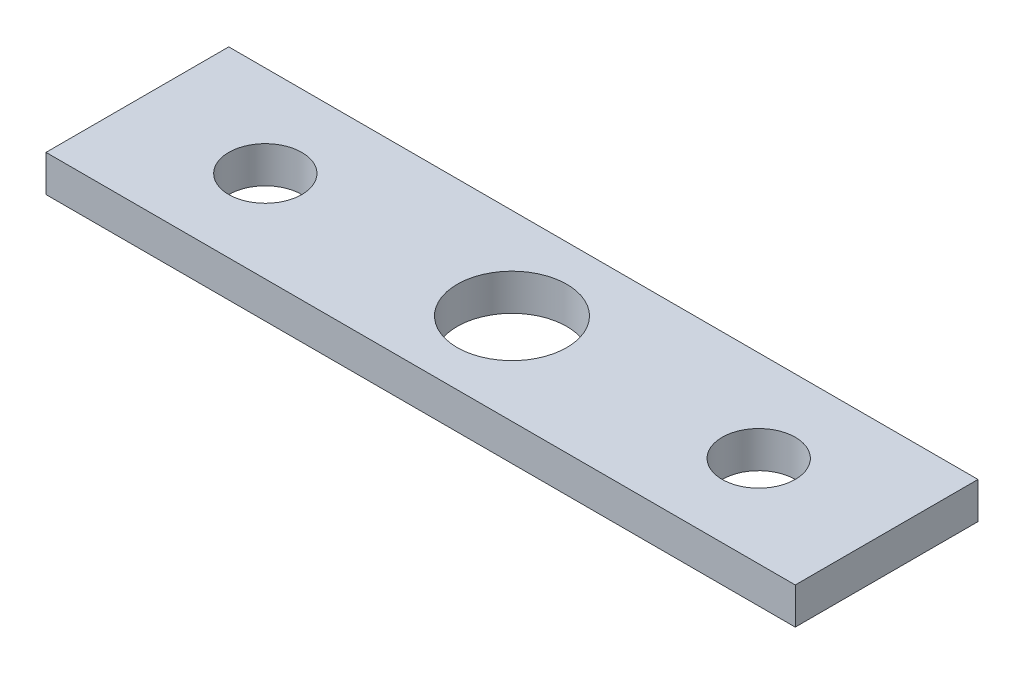
ISO-10303-21;
HEADER;
FILE_DESCRIPTION(('STEP AP214'),'2;1');
FILE_NAME('part.step','',(''),(''),'','','');
FILE_SCHEMA(('AUTOMOTIVE_DESIGN { 1 0 10303 214 1 1 1 1 }'));
ENDSEC;
DATA;
#1=APPLICATION_CONTEXT('core data for automotive mechanical design processes');
#2=APPLICATION_PROTOCOL_DEFINITION('international standard','automotive_design',2000,#1);
#3=PRODUCT_CONTEXT('',#1,'mechanical');
#4=PRODUCT('Part','Part','',(#3));
#5=PRODUCT_RELATED_PRODUCT_CATEGORY('part','',(#4));
#6=PRODUCT_DEFINITION_FORMATION('','',#4);
#7=PRODUCT_DEFINITION_CONTEXT('part definition',#1,'design');
#8=PRODUCT_DEFINITION('design','',#6,#7);
#9=PRODUCT_DEFINITION_SHAPE('','',#8);
#10=(LENGTH_UNIT() NAMED_UNIT(*) SI_UNIT(.MILLI.,.METRE.));
#11=(NAMED_UNIT(*) PLANE_ANGLE_UNIT() SI_UNIT($,.RADIAN.));
#12=(NAMED_UNIT(*) SI_UNIT($,.STERADIAN.) SOLID_ANGLE_UNIT());
#13=UNCERTAINTY_MEASURE_WITH_UNIT(LENGTH_MEASURE(1.E-05),#10,'distance_accuracy_value','');
#14=(GEOMETRIC_REPRESENTATION_CONTEXT(3) GLOBAL_UNCERTAINTY_ASSIGNED_CONTEXT((#13)) GLOBAL_UNIT_ASSIGNED_CONTEXT((#10,
#11,#12)) REPRESENTATION_CONTEXT('',''));
#15=CARTESIAN_POINT('',(0.,0.,0.));
#16=DIRECTION('',(0.,0.,1.));
#17=DIRECTION('',(1.,0.,0.));
#18=AXIS2_PLACEMENT_3D('',#15,#16,#17);
#19=CARTESIAN_POINT('',(0.,2.,0.));
#20=DIRECTION('',(0.,-1.,0.));
#21=DIRECTION('',(0.,0.,-1.));
#22=AXIS2_PLACEMENT_3D('',#19,#20,#21);
#23=PLANE('',#22);
#24=CARTESIAN_POINT('',(4.,2.,-5.));
#25=DIRECTION('',(0.,-1.,0.));
#26=DIRECTION('',(0.,0.,-1.));
#27=AXIS2_PLACEMENT_3D('',#24,#25,#26);
#28=CIRCLE('',#27,2.);
#29=CARTESIAN_POINT('',(4.,2.,-7.));
#30=VERTEX_POINT('',#29);
#31=EDGE_CURVE('E116',#30,#30,#28,.T.);
#32=ORIENTED_EDGE('',*,*,#31,.T.);
#33=EDGE_LOOP('',(#32));
#34=FACE_BOUND('',#33,.T.);
#35=CARTESIAN_POINT('',(31.,2.,-5.));
#36=DIRECTION('',(0.,-1.,0.));
#37=DIRECTION('',(0.,0.,-1.));
#38=AXIS2_PLACEMENT_3D('',#35,#36,#37);
#39=CIRCLE('',#38,2.00000000000001);
#40=CARTESIAN_POINT('',(31.,2.,-7.00000000000001));
#41=VERTEX_POINT('',#40);
#42=EDGE_CURVE('E111',#41,#41,#39,.T.);
#43=ORIENTED_EDGE('',*,*,#42,.T.);
#44=EDGE_LOOP('',(#43));
#45=FACE_BOUND('',#44,.T.);
#46=DIRECTION('',(-1.,0.,0.));
#47=VECTOR('',#46,1.);
#48=CARTESIAN_POINT('',(0.,2.,-10.));
#49=LINE('',#48,#47);
#50=CARTESIAN_POINT('',(38.,2.,-10.));
#51=VERTEX_POINT('',#50);
#52=CARTESIAN_POINT('',(-3.,2.,-10.));
#53=VERTEX_POINT('',#52);
#54=EDGE_CURVE('E11',#51,#53,#49,.T.);
#55=ORIENTED_EDGE('',*,*,#54,.T.);
#56=DIRECTION('',(0.,0.,-1.));
#57=VECTOR('',#56,1.);
#58=CARTESIAN_POINT('',(-3.,2.,0.));
#59=LINE('',#58,#57);
#60=CARTESIAN_POINT('',(-3.,2.,0.));
#61=VERTEX_POINT('',#60);
#62=EDGE_CURVE('E100',#61,#53,#59,.T.);
#63=ORIENTED_EDGE('',*,*,#62,.F.);
#64=DIRECTION('',(1.,0.,0.));
#65=VECTOR('',#64,1.);
#66=CARTESIAN_POINT('',(0.,2.,0.));
#67=LINE('',#66,#65);
#68=CARTESIAN_POINT('',(38.,2.,0.));
#69=VERTEX_POINT('',#68);
#70=EDGE_CURVE('E44',#61,#69,#67,.T.);
#71=ORIENTED_EDGE('',*,*,#70,.T.);
#72=DIRECTION('',(0.,0.,1.));
#73=VECTOR('',#72,1.);
#74=CARTESIAN_POINT('',(38.,2.,0.));
#75=LINE('',#74,#73);
#76=EDGE_CURVE('E94',#51,#69,#75,.T.);
#77=ORIENTED_EDGE('',*,*,#76,.F.);
#78=EDGE_LOOP('',(#55,#63,#71,#77));
#79=FACE_BOUND('',#78,.T.);
#80=CARTESIAN_POINT('',(17.4999999999984,2.,-4.99999999999995));
#81=DIRECTION('',(0.,1.,0.));
#82=DIRECTION('',(0.,0.,1.));
#83=AXIS2_PLACEMENT_3D('',#80,#81,#82);
#84=CIRCLE('',#83,3.);
#85=CARTESIAN_POINT('',(17.4999999999984,2.,-1.99999999999995));
#86=VERTEX_POINT('',#85);
#87=EDGE_CURVE('E82',#86,#86,#84,.T.);
#88=ORIENTED_EDGE('',*,*,#87,.F.);
#89=EDGE_LOOP('',(#88));
#90=FACE_BOUND('',#89,.T.);
#91=ADVANCED_FACE('F35',(#34,#45,#79,#90),#23,.F.);
#92=CARTESIAN_POINT('',(0.,0.,0.));
#93=DIRECTION('',(0.,-1.,0.));
#94=DIRECTION('',(0.,0.,-1.));
#95=AXIS2_PLACEMENT_3D('',#92,#93,#94);
#96=PLANE('',#95);
#97=CARTESIAN_POINT('',(4.,0.,-5.));
#98=DIRECTION('',(0.,-1.,0.));
#99=DIRECTION('',(0.,0.,-1.));
#100=AXIS2_PLACEMENT_3D('',#97,#98,#99);
#101=CIRCLE('',#100,2.);
#102=CARTESIAN_POINT('',(4.,0.,-7.));
#103=VERTEX_POINT('',#102);
#104=EDGE_CURVE('E108',#103,#103,#101,.T.);
#105=ORIENTED_EDGE('',*,*,#104,.F.);
#106=EDGE_LOOP('',(#105));
#107=FACE_BOUND('',#106,.T.);
#108=CARTESIAN_POINT('',(31.,0.,-5.));
#109=DIRECTION('',(0.,-1.,0.));
#110=DIRECTION('',(0.,0.,-1.));
#111=AXIS2_PLACEMENT_3D('',#108,#109,#110);
#112=CIRCLE('',#111,2.00000000000001);
#113=CARTESIAN_POINT('',(31.,0.,-7.00000000000001));
#114=VERTEX_POINT('',#113);
#115=EDGE_CURVE('E107',#114,#114,#112,.T.);
#116=ORIENTED_EDGE('',*,*,#115,.F.);
#117=EDGE_LOOP('',(#116));
#118=FACE_BOUND('',#117,.T.);
#119=DIRECTION('',(1.,0.,0.));
#120=VECTOR('',#119,1.);
#121=CARTESIAN_POINT('',(0.,0.,0.));
#122=LINE('',#121,#120);
#123=CARTESIAN_POINT('',(-3.,0.,0.));
#124=VERTEX_POINT('',#123);
#125=CARTESIAN_POINT('',(38.,0.,0.));
#126=VERTEX_POINT('',#125);
#127=EDGE_CURVE('E52',#124,#126,#122,.T.);
#128=ORIENTED_EDGE('',*,*,#127,.F.);
#129=DIRECTION('',(0.,0.,1.));
#130=VECTOR('',#129,1.);
#131=CARTESIAN_POINT('',(-3.,0.,0.));
#132=LINE('',#131,#130);
#133=CARTESIAN_POINT('',(-3.,0.,-10.));
#134=VERTEX_POINT('',#133);
#135=EDGE_CURVE('E105',#134,#124,#132,.T.);
#136=ORIENTED_EDGE('',*,*,#135,.F.);
#137=DIRECTION('',(-1.,0.,0.));
#138=VECTOR('',#137,1.);
#139=CARTESIAN_POINT('',(0.,0.,-10.));
#140=LINE('',#139,#138);
#141=CARTESIAN_POINT('',(38.,0.,-10.));
#142=VERTEX_POINT('',#141);
#143=EDGE_CURVE('E39',#142,#134,#140,.T.);
#144=ORIENTED_EDGE('',*,*,#143,.F.);
#145=DIRECTION('',(0.,0.,-1.));
#146=VECTOR('',#145,1.);
#147=CARTESIAN_POINT('',(38.,0.,0.));
#148=LINE('',#147,#146);
#149=EDGE_CURVE('E84',#126,#142,#148,.T.);
#150=ORIENTED_EDGE('',*,*,#149,.F.);
#151=EDGE_LOOP('',(#128,#136,#144,#150));
#152=FACE_BOUND('',#151,.T.);
#153=CARTESIAN_POINT('',(17.4999999999984,0.,-4.99999999999995));
#154=DIRECTION('',(0.,1.,0.));
#155=DIRECTION('',(0.,0.,1.));
#156=AXIS2_PLACEMENT_3D('',#153,#154,#155);
#157=CIRCLE('',#156,3.);
#158=CARTESIAN_POINT('',(17.4999999999984,0.,-1.99999999999995));
#159=VERTEX_POINT('',#158);
#160=EDGE_CURVE('E119',#159,#159,#157,.T.);
#161=ORIENTED_EDGE('',*,*,#160,.T.);
#162=EDGE_LOOP('',(#161));
#163=FACE_BOUND('',#162,.T.);
#164=ADVANCED_FACE('F85',(#107,#118,#152,#163),#96,.T.);
#165=CARTESIAN_POINT('',(0.,2.,0.));
#166=DIRECTION('',(0.,0.,-1.));
#167=DIRECTION('',(-1.,0.,0.));
#168=AXIS2_PLACEMENT_3D('',#165,#166,#167);
#169=PLANE('',#168);
#170=ORIENTED_EDGE('',*,*,#127,.T.);
#171=DIRECTION('',(0.,-1.,0.));
#172=VECTOR('',#171,1.);
#173=CARTESIAN_POINT('',(38.,0.,0.));
#174=LINE('',#173,#172);
#175=EDGE_CURVE('E79',#69,#126,#174,.T.);
#176=ORIENTED_EDGE('',*,*,#175,.F.);
#177=ORIENTED_EDGE('',*,*,#70,.F.);
#178=DIRECTION('',(0.,1.,0.));
#179=VECTOR('',#178,1.);
#180=CARTESIAN_POINT('',(-3.,2.,0.));
#181=LINE('',#180,#179);
#182=EDGE_CURVE('E81',#124,#61,#181,.T.);
#183=ORIENTED_EDGE('',*,*,#182,.F.);
#184=EDGE_LOOP('',(#170,#176,#177,#183));
#185=FACE_BOUND('',#184,.T.);
#186=ADVANCED_FACE('F37',(#185),#169,.F.);
#187=CARTESIAN_POINT('',(0.,2.,-10.));
#188=DIRECTION('',(0.,0.,1.));
#189=DIRECTION('',(1.,0.,0.));
#190=AXIS2_PLACEMENT_3D('',#187,#188,#189);
#191=PLANE('',#190);
#192=ORIENTED_EDGE('',*,*,#143,.T.);
#193=DIRECTION('',(0.,-1.,0.));
#194=VECTOR('',#193,1.);
#195=CARTESIAN_POINT('',(-3.,2.,-10.));
#196=LINE('',#195,#194);
#197=EDGE_CURVE('E103',#53,#134,#196,.T.);
#198=ORIENTED_EDGE('',*,*,#197,.F.);
#199=ORIENTED_EDGE('',*,*,#54,.F.);
#200=DIRECTION('',(0.,1.,0.));
#201=VECTOR('',#200,1.);
#202=CARTESIAN_POINT('',(38.,0.,-10.));
#203=LINE('',#202,#201);
#204=EDGE_CURVE('E89',#142,#51,#203,.T.);
#205=ORIENTED_EDGE('',*,*,#204,.F.);
#206=EDGE_LOOP('',(#192,#198,#199,#205));
#207=FACE_BOUND('',#206,.T.);
#208=ADVANCED_FACE('F129',(#207),#191,.F.);
#209=CARTESIAN_POINT('',(17.4999999999984,2.,-4.99999999999995));
#210=DIRECTION('',(0.,-1.,0.));
#211=DIRECTION('',(0.,0.,-1.));
#212=AXIS2_PLACEMENT_3D('',#209,#210,#211);
#213=CYLINDRICAL_SURFACE('',#212,3.);
#214=ORIENTED_EDGE('',*,*,#87,.T.);
#215=EDGE_LOOP('',(#214));
#216=FACE_BOUND('',#215,.T.);
#217=ORIENTED_EDGE('',*,*,#160,.F.);
#218=EDGE_LOOP('',(#217));
#219=FACE_BOUND('',#218,.T.);
#220=ADVANCED_FACE('F131',(#216,#219),#213,.F.);
#221=CARTESIAN_POINT('',(31.,20.,-5.));
#222=DIRECTION('',(0.,-1.,0.));
#223=DIRECTION('',(0.,0.,-1.));
#224=AXIS2_PLACEMENT_3D('',#221,#222,#223);
#225=CYLINDRICAL_SURFACE('',#224,2.00000000000001);
#226=ORIENTED_EDGE('',*,*,#115,.T.);
#227=EDGE_LOOP('',(#226));
#228=FACE_BOUND('',#227,.T.);
#229=ORIENTED_EDGE('',*,*,#42,.F.);
#230=EDGE_LOOP('',(#229));
#231=FACE_BOUND('',#230,.T.);
#232=ADVANCED_FACE('F136',(#228,#231),#225,.F.);
#233=CARTESIAN_POINT('',(4.,20.,-5.));
#234=DIRECTION('',(0.,-1.,0.));
#235=DIRECTION('',(0.,0.,-1.));
#236=AXIS2_PLACEMENT_3D('',#233,#234,#235);
#237=CYLINDRICAL_SURFACE('',#236,2.);
#238=ORIENTED_EDGE('',*,*,#104,.T.);
#239=EDGE_LOOP('',(#238));
#240=FACE_BOUND('',#239,.T.);
#241=ORIENTED_EDGE('',*,*,#31,.F.);
#242=EDGE_LOOP('',(#241));
#243=FACE_BOUND('',#242,.T.);
#244=ADVANCED_FACE('F151',(#240,#243),#237,.F.);
#245=CARTESIAN_POINT('',(-3.,0.,0.));
#246=DIRECTION('',(1.,0.,0.));
#247=DIRECTION('',(0.,0.,-1.));
#248=AXIS2_PLACEMENT_3D('',#245,#246,#247);
#249=PLANE('',#248);
#250=ORIENTED_EDGE('',*,*,#182,.T.);
#251=ORIENTED_EDGE('',*,*,#62,.T.);
#252=ORIENTED_EDGE('',*,*,#197,.T.);
#253=ORIENTED_EDGE('',*,*,#135,.T.);
#254=EDGE_LOOP('',(#250,#251,#252,#253));
#255=FACE_BOUND('',#254,.T.);
#256=ADVANCED_FACE('F128',(#255),#249,.F.);
#257=CARTESIAN_POINT('',(38.,0.,0.));
#258=DIRECTION('',(-1.,0.,0.));
#259=DIRECTION('',(0.,0.,1.));
#260=AXIS2_PLACEMENT_3D('',#257,#258,#259);
#261=PLANE('',#260);
#262=ORIENTED_EDGE('',*,*,#175,.T.);
#263=ORIENTED_EDGE('',*,*,#149,.T.);
#264=ORIENTED_EDGE('',*,*,#204,.T.);
#265=ORIENTED_EDGE('',*,*,#76,.T.);
#266=EDGE_LOOP('',(#262,#263,#264,#265));
#267=FACE_BOUND('',#266,.T.);
#268=ADVANCED_FACE('F92',(#267),#261,.F.);
#269=CLOSED_SHELL('',(#91,#164,#186,#208,#220,#232,#244,#256,#268));
#270=MANIFOLD_SOLID_BREP('B2',#269);
#271=ADVANCED_BREP_SHAPE_REPRESENTATION('',(#18,#270),#14);
#272=SHAPE_DEFINITION_REPRESENTATION(#9,#271);
ENDSEC;
END-ISO-10303-21;
